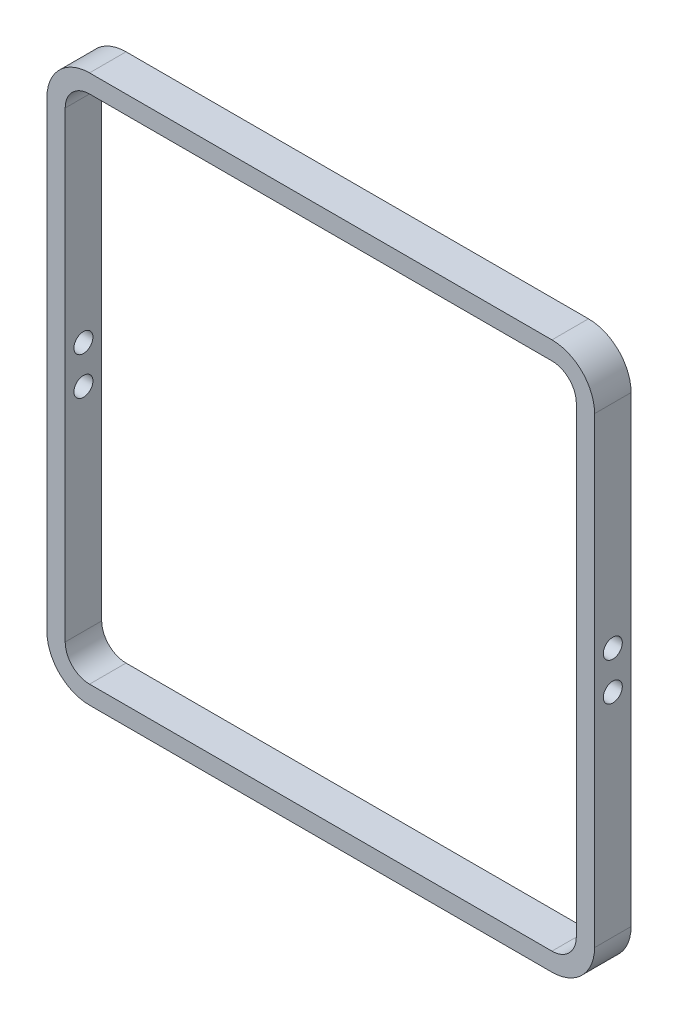
ISO-10303-21;
HEADER;
FILE_DESCRIPTION(('STEP AP214'),'2;1');
FILE_NAME('part.step','',(''),(''),'','','');
FILE_SCHEMA(('AUTOMOTIVE_DESIGN { 1 0 10303 214 1 1 1 1 }'));
ENDSEC;
DATA;
#1=APPLICATION_CONTEXT('core data for automotive mechanical design processes');
#2=APPLICATION_PROTOCOL_DEFINITION('international standard','automotive_design',2000,#1);
#3=PRODUCT_CONTEXT('',#1,'mechanical');
#4=PRODUCT('Part','Part','',(#3));
#5=PRODUCT_RELATED_PRODUCT_CATEGORY('part','',(#4));
#6=PRODUCT_DEFINITION_FORMATION('','',#4);
#7=PRODUCT_DEFINITION_CONTEXT('part definition',#1,'design');
#8=PRODUCT_DEFINITION('design','',#6,#7);
#9=PRODUCT_DEFINITION_SHAPE('','',#8);
#10=(LENGTH_UNIT() NAMED_UNIT(*) SI_UNIT(.MILLI.,.METRE.));
#11=(NAMED_UNIT(*) PLANE_ANGLE_UNIT() SI_UNIT($,.RADIAN.));
#12=(NAMED_UNIT(*) SI_UNIT($,.STERADIAN.) SOLID_ANGLE_UNIT());
#13=UNCERTAINTY_MEASURE_WITH_UNIT(LENGTH_MEASURE(1.E-05),#10,'distance_accuracy_value','');
#14=(GEOMETRIC_REPRESENTATION_CONTEXT(3) GLOBAL_UNCERTAINTY_ASSIGNED_CONTEXT((#13)) GLOBAL_UNIT_ASSIGNED_CONTEXT((#10,
#11,#12)) REPRESENTATION_CONTEXT('',''));
#15=CARTESIAN_POINT('',(0.,0.,0.));
#16=DIRECTION('',(0.,0.,1.));
#17=DIRECTION('',(1.,0.,0.));
#18=AXIS2_PLACEMENT_3D('',#15,#16,#17);
#19=CARTESIAN_POINT('',(0.,0.,15.));
#20=DIRECTION('',(0.,0.,-1.));
#21=DIRECTION('',(-1.,0.,0.));
#22=AXIS2_PLACEMENT_3D('',#19,#20,#21);
#23=PLANE('',#22);
#24=DIRECTION('',(0.,-1.,0.));
#25=VECTOR('',#24,1.);
#26=CARTESIAN_POINT('',(-112.5,-112.5,15.));
#27=LINE('',#26,#25);
#28=CARTESIAN_POINT('',(-112.5,95.,15.));
#29=VERTEX_POINT('',#28);
#30=CARTESIAN_POINT('',(-112.5,-95.,15.));
#31=VERTEX_POINT('',#30);
#32=EDGE_CURVE('E253',#29,#31,#27,.T.);
#33=ORIENTED_EDGE('',*,*,#32,.T.);
#34=CARTESIAN_POINT('',(-95.,-95.,15.));
#35=DIRECTION('',(0.,0.,-1.));
#36=DIRECTION('',(-1.,0.,0.));
#37=AXIS2_PLACEMENT_3D('',#34,#35,#36);
#38=CIRCLE('',#37,17.5);
#39=CARTESIAN_POINT('',(-95.,-112.5,15.));
#40=VERTEX_POINT('',#39);
#41=EDGE_CURVE('E232',#31,#40,#38,.F.);
#42=ORIENTED_EDGE('',*,*,#41,.T.);
#43=DIRECTION('',(1.,0.,0.));
#44=VECTOR('',#43,1.);
#45=CARTESIAN_POINT('',(112.5,-112.5,15.));
#46=LINE('',#45,#44);
#47=CARTESIAN_POINT('',(95.,-112.5,15.));
#48=VERTEX_POINT('',#47);
#49=EDGE_CURVE('E181',#40,#48,#46,.T.);
#50=ORIENTED_EDGE('',*,*,#49,.T.);
#51=CARTESIAN_POINT('',(95.,-95.,15.));
#52=DIRECTION('',(0.,0.,-1.));
#53=DIRECTION('',(-1.,0.,0.));
#54=AXIS2_PLACEMENT_3D('',#51,#52,#53);
#55=CIRCLE('',#54,17.5);
#56=CARTESIAN_POINT('',(112.5,-95.,15.));
#57=VERTEX_POINT('',#56);
#58=EDGE_CURVE('E56',#48,#57,#55,.F.);
#59=ORIENTED_EDGE('',*,*,#58,.T.);
#60=DIRECTION('',(0.,1.,0.));
#61=VECTOR('',#60,1.);
#62=CARTESIAN_POINT('',(112.5,-112.5,15.));
#63=LINE('',#62,#61);
#64=CARTESIAN_POINT('',(112.5,95.,15.));
#65=VERTEX_POINT('',#64);
#66=EDGE_CURVE('E180',#57,#65,#63,.T.);
#67=ORIENTED_EDGE('',*,*,#66,.T.);
#68=CARTESIAN_POINT('',(95.,95.,15.));
#69=DIRECTION('',(0.,0.,-1.));
#70=DIRECTION('',(-1.,0.,0.));
#71=AXIS2_PLACEMENT_3D('',#68,#69,#70);
#72=CIRCLE('',#71,17.5);
#73=CARTESIAN_POINT('',(95.,112.5,15.));
#74=VERTEX_POINT('',#73);
#75=EDGE_CURVE('E231',#65,#74,#72,.F.);
#76=ORIENTED_EDGE('',*,*,#75,.T.);
#77=DIRECTION('',(-1.,0.,0.));
#78=VECTOR('',#77,1.);
#79=CARTESIAN_POINT('',(112.5,112.5,15.));
#80=LINE('',#79,#78);
#81=CARTESIAN_POINT('',(-95.,112.5,15.));
#82=VERTEX_POINT('',#81);
#83=EDGE_CURVE('E252',#74,#82,#80,.T.);
#84=ORIENTED_EDGE('',*,*,#83,.T.);
#85=CARTESIAN_POINT('',(-95.,95.,15.));
#86=DIRECTION('',(0.,0.,-1.));
#87=DIRECTION('',(-1.,0.,0.));
#88=AXIS2_PLACEMENT_3D('',#85,#86,#87);
#89=CIRCLE('',#88,17.5);
#90=EDGE_CURVE('E233',#82,#29,#89,.F.);
#91=ORIENTED_EDGE('',*,*,#90,.T.);
#92=EDGE_LOOP('',(#33,#42,#50,#59,#67,#76,#84,#91));
#93=FACE_BOUND('',#92,.T.);
#94=DIRECTION('',(-1.,0.,0.));
#95=VECTOR('',#94,1.);
#96=CARTESIAN_POINT('',(105.,105.,15.));
#97=LINE('',#96,#95);
#98=CARTESIAN_POINT('',(95.,105.,15.));
#99=VERTEX_POINT('',#98);
#100=CARTESIAN_POINT('',(-95.,105.,15.));
#101=VERTEX_POINT('',#100);
#102=EDGE_CURVE('E173',#99,#101,#97,.T.);
#103=ORIENTED_EDGE('',*,*,#102,.F.);
#104=CARTESIAN_POINT('',(95.,95.,15.));
#105=DIRECTION('',(0.,0.,-1.));
#106=DIRECTION('',(-1.,0.,0.));
#107=AXIS2_PLACEMENT_3D('',#104,#105,#106);
#108=CIRCLE('',#107,10.);
#109=CARTESIAN_POINT('',(105.,95.,15.));
#110=VERTEX_POINT('',#109);
#111=EDGE_CURVE('E161',#99,#110,#108,.T.);
#112=ORIENTED_EDGE('',*,*,#111,.T.);
#113=DIRECTION('',(0.,1.,0.));
#114=VECTOR('',#113,1.);
#115=CARTESIAN_POINT('',(105.,-105.,15.));
#116=LINE('',#115,#114);
#117=CARTESIAN_POINT('',(105.,-95.,15.));
#118=VERTEX_POINT('',#117);
#119=EDGE_CURVE('E295',#118,#110,#116,.T.);
#120=ORIENTED_EDGE('',*,*,#119,.F.);
#121=CARTESIAN_POINT('',(95.,-95.,15.));
#122=DIRECTION('',(0.,0.,-1.));
#123=DIRECTION('',(-1.,0.,0.));
#124=AXIS2_PLACEMENT_3D('',#121,#122,#123);
#125=CIRCLE('',#124,10.);
#126=CARTESIAN_POINT('',(95.,-105.,15.));
#127=VERTEX_POINT('',#126);
#128=EDGE_CURVE('E162',#118,#127,#125,.T.);
#129=ORIENTED_EDGE('',*,*,#128,.T.);
#130=DIRECTION('',(1.,0.,0.));
#131=VECTOR('',#130,1.);
#132=CARTESIAN_POINT('',(105.,-105.,15.));
#133=LINE('',#132,#131);
#134=CARTESIAN_POINT('',(-95.0000000000001,-105.,15.));
#135=VERTEX_POINT('',#134);
#136=EDGE_CURVE('E293',#135,#127,#133,.T.);
#137=ORIENTED_EDGE('',*,*,#136,.F.);
#138=CARTESIAN_POINT('',(-95.,-95.,15.));
#139=DIRECTION('',(0.,0.,-1.));
#140=DIRECTION('',(-1.,0.,0.));
#141=AXIS2_PLACEMENT_3D('',#138,#139,#140);
#142=CIRCLE('',#141,10.);
#143=CARTESIAN_POINT('',(-105.,-95.,15.));
#144=VERTEX_POINT('',#143);
#145=EDGE_CURVE('E208',#135,#144,#142,.T.);
#146=ORIENTED_EDGE('',*,*,#145,.T.);
#147=DIRECTION('',(0.,-1.,0.));
#148=VECTOR('',#147,1.);
#149=CARTESIAN_POINT('',(-105.,-105.,15.));
#150=LINE('',#149,#148);
#151=CARTESIAN_POINT('',(-105.,95.,15.));
#152=VERTEX_POINT('',#151);
#153=EDGE_CURVE('E286',#152,#144,#150,.T.);
#154=ORIENTED_EDGE('',*,*,#153,.F.);
#155=CARTESIAN_POINT('',(-95.,95.,15.));
#156=DIRECTION('',(0.,0.,-1.));
#157=DIRECTION('',(-1.,0.,0.));
#158=AXIS2_PLACEMENT_3D('',#155,#156,#157);
#159=CIRCLE('',#158,10.);
#160=EDGE_CURVE('E207',#152,#101,#159,.T.);
#161=ORIENTED_EDGE('',*,*,#160,.T.);
#162=EDGE_LOOP('',(#103,#112,#120,#129,#137,#146,#154,#161));
#163=FACE_BOUND('',#162,.T.);
#164=ADVANCED_FACE('F39',(#93,#163),#23,.F.);
#165=CARTESIAN_POINT('',(0.,0.,0.));
#166=DIRECTION('',(0.,0.,-1.));
#167=DIRECTION('',(-1.,0.,0.));
#168=AXIS2_PLACEMENT_3D('',#165,#166,#167);
#169=PLANE('',#168);
#170=DIRECTION('',(1.,0.,0.));
#171=VECTOR('',#170,1.);
#172=CARTESIAN_POINT('',(112.5,-112.5,0.));
#173=LINE('',#172,#171);
#174=CARTESIAN_POINT('',(-95.,-112.5,0.));
#175=VERTEX_POINT('',#174);
#176=CARTESIAN_POINT('',(95.,-112.5,0.));
#177=VERTEX_POINT('',#176);
#178=EDGE_CURVE('E255',#175,#177,#173,.T.);
#179=ORIENTED_EDGE('',*,*,#178,.F.);
#180=CARTESIAN_POINT('',(-95.,-95.,0.));
#181=DIRECTION('',(0.,0.,-1.));
#182=DIRECTION('',(-1.,0.,0.));
#183=AXIS2_PLACEMENT_3D('',#180,#181,#182);
#184=CIRCLE('',#183,17.5);
#185=CARTESIAN_POINT('',(-112.5,-95.,0.));
#186=VERTEX_POINT('',#185);
#187=EDGE_CURVE('E221',#175,#186,#184,.T.);
#188=ORIENTED_EDGE('',*,*,#187,.T.);
#189=DIRECTION('',(0.,-1.,0.));
#190=VECTOR('',#189,1.);
#191=CARTESIAN_POINT('',(-112.5,-112.5,0.));
#192=LINE('',#191,#190);
#193=CARTESIAN_POINT('',(-112.5,95.,0.));
#194=VERTEX_POINT('',#193);
#195=EDGE_CURVE('E260',#194,#186,#192,.T.);
#196=ORIENTED_EDGE('',*,*,#195,.F.);
#197=CARTESIAN_POINT('',(-95.,95.,0.));
#198=DIRECTION('',(0.,0.,-1.));
#199=DIRECTION('',(-1.,0.,0.));
#200=AXIS2_PLACEMENT_3D('',#197,#198,#199);
#201=CIRCLE('',#200,17.5);
#202=CARTESIAN_POINT('',(-95.,112.5,0.));
#203=VERTEX_POINT('',#202);
#204=EDGE_CURVE('E218',#194,#203,#201,.T.);
#205=ORIENTED_EDGE('',*,*,#204,.T.);
#206=DIRECTION('',(-1.,0.,0.));
#207=VECTOR('',#206,1.);
#208=CARTESIAN_POINT('',(112.5,112.5,0.));
#209=LINE('',#208,#207);
#210=CARTESIAN_POINT('',(95.,112.5,0.));
#211=VERTEX_POINT('',#210);
#212=EDGE_CURVE('E298',#211,#203,#209,.T.);
#213=ORIENTED_EDGE('',*,*,#212,.F.);
#214=CARTESIAN_POINT('',(95.,95.,0.));
#215=DIRECTION('',(0.,0.,-1.));
#216=DIRECTION('',(-1.,0.,0.));
#217=AXIS2_PLACEMENT_3D('',#214,#215,#216);
#218=CIRCLE('',#217,17.5);
#219=CARTESIAN_POINT('',(112.5,95.,0.));
#220=VERTEX_POINT('',#219);
#221=EDGE_CURVE('E223',#211,#220,#218,.T.);
#222=ORIENTED_EDGE('',*,*,#221,.T.);
#223=DIRECTION('',(0.,1.,0.));
#224=VECTOR('',#223,1.);
#225=CARTESIAN_POINT('',(112.5,-112.5,0.));
#226=LINE('',#225,#224);
#227=CARTESIAN_POINT('',(112.5,-95.,0.));
#228=VERTEX_POINT('',#227);
#229=EDGE_CURVE('E244',#228,#220,#226,.T.);
#230=ORIENTED_EDGE('',*,*,#229,.F.);
#231=CARTESIAN_POINT('',(95.,-95.,0.));
#232=DIRECTION('',(0.,0.,-1.));
#233=DIRECTION('',(-1.,0.,0.));
#234=AXIS2_PLACEMENT_3D('',#231,#232,#233);
#235=CIRCLE('',#234,17.5);
#236=EDGE_CURVE('E220',#228,#177,#235,.T.);
#237=ORIENTED_EDGE('',*,*,#236,.T.);
#238=EDGE_LOOP('',(#179,#188,#196,#205,#213,#222,#230,#237));
#239=FACE_BOUND('',#238,.T.);
#240=DIRECTION('',(1.,0.,0.));
#241=VECTOR('',#240,1.);
#242=CARTESIAN_POINT('',(105.,-105.,0.));
#243=LINE('',#242,#241);
#244=CARTESIAN_POINT('',(-95.0000000000001,-105.,0.));
#245=VERTEX_POINT('',#244);
#246=CARTESIAN_POINT('',(95.,-105.,0.));
#247=VERTEX_POINT('',#246);
#248=EDGE_CURVE('E160',#245,#247,#243,.T.);
#249=ORIENTED_EDGE('',*,*,#248,.T.);
#250=CARTESIAN_POINT('',(95.,-95.,0.));
#251=DIRECTION('',(0.,0.,-1.));
#252=DIRECTION('',(-1.,0.,0.));
#253=AXIS2_PLACEMENT_3D('',#250,#251,#252);
#254=CIRCLE('',#253,10.);
#255=CARTESIAN_POINT('',(105.,-95.,0.));
#256=VERTEX_POINT('',#255);
#257=EDGE_CURVE('E155',#247,#256,#254,.F.);
#258=ORIENTED_EDGE('',*,*,#257,.T.);
#259=DIRECTION('',(0.,1.,0.));
#260=VECTOR('',#259,1.);
#261=CARTESIAN_POINT('',(105.,-105.,0.));
#262=LINE('',#261,#260);
#263=CARTESIAN_POINT('',(105.,95.,0.));
#264=VERTEX_POINT('',#263);
#265=EDGE_CURVE('E154',#256,#264,#262,.T.);
#266=ORIENTED_EDGE('',*,*,#265,.T.);
#267=CARTESIAN_POINT('',(95.,95.,0.));
#268=DIRECTION('',(0.,0.,-1.));
#269=DIRECTION('',(-1.,0.,0.));
#270=AXIS2_PLACEMENT_3D('',#267,#268,#269);
#271=CIRCLE('',#270,10.);
#272=CARTESIAN_POINT('',(95.,105.,0.));
#273=VERTEX_POINT('',#272);
#274=EDGE_CURVE('E199',#264,#273,#271,.F.);
#275=ORIENTED_EDGE('',*,*,#274,.T.);
#276=DIRECTION('',(-1.,0.,0.));
#277=VECTOR('',#276,1.);
#278=CARTESIAN_POINT('',(105.,105.,0.));
#279=LINE('',#278,#277);
#280=CARTESIAN_POINT('',(-95.,105.,0.));
#281=VERTEX_POINT('',#280);
#282=EDGE_CURVE('E284',#273,#281,#279,.T.);
#283=ORIENTED_EDGE('',*,*,#282,.T.);
#284=CARTESIAN_POINT('',(-95.,95.,0.));
#285=DIRECTION('',(0.,0.,-1.));
#286=DIRECTION('',(-1.,0.,0.));
#287=AXIS2_PLACEMENT_3D('',#284,#285,#286);
#288=CIRCLE('',#287,10.);
#289=CARTESIAN_POINT('',(-105.,95.,0.));
#290=VERTEX_POINT('',#289);
#291=EDGE_CURVE('E202',#281,#290,#288,.F.);
#292=ORIENTED_EDGE('',*,*,#291,.T.);
#293=DIRECTION('',(0.,-1.,0.));
#294=VECTOR('',#293,1.);
#295=CARTESIAN_POINT('',(-105.,-105.,0.));
#296=LINE('',#295,#294);
#297=CARTESIAN_POINT('',(-105.,-95.,0.));
#298=VERTEX_POINT('',#297);
#299=EDGE_CURVE('E299',#290,#298,#296,.T.);
#300=ORIENTED_EDGE('',*,*,#299,.T.);
#301=CARTESIAN_POINT('',(-95.,-95.,0.));
#302=DIRECTION('',(0.,0.,-1.));
#303=DIRECTION('',(-1.,0.,0.));
#304=AXIS2_PLACEMENT_3D('',#301,#302,#303);
#305=CIRCLE('',#304,10.);
#306=EDGE_CURVE('E206',#298,#245,#305,.F.);
#307=ORIENTED_EDGE('',*,*,#306,.T.);
#308=EDGE_LOOP('',(#249,#258,#266,#275,#283,#292,#300,#307));
#309=FACE_BOUND('',#308,.T.);
#310=ADVANCED_FACE('F153',(#239,#309),#169,.T.);
#311=CARTESIAN_POINT('',(112.5,112.5,15.));
#312=DIRECTION('',(0.,-1.,0.));
#313=DIRECTION('',(1.,0.,0.));
#314=AXIS2_PLACEMENT_3D('',#311,#312,#313);
#315=PLANE('',#314);
#316=ORIENTED_EDGE('',*,*,#83,.F.);
#317=DIRECTION('',(0.,0.,-1.));
#318=VECTOR('',#317,1.);
#319=CARTESIAN_POINT('',(95.,112.5,15.));
#320=LINE('',#319,#318);
#321=EDGE_CURVE('E237',#74,#211,#320,.T.);
#322=ORIENTED_EDGE('',*,*,#321,.T.);
#323=ORIENTED_EDGE('',*,*,#212,.T.);
#324=DIRECTION('',(0.,0.,-1.));
#325=VECTOR('',#324,1.);
#326=CARTESIAN_POINT('',(-95.,112.5,15.));
#327=LINE('',#326,#325);
#328=EDGE_CURVE('E240',#203,#82,#327,.F.);
#329=ORIENTED_EDGE('',*,*,#328,.T.);
#330=EDGE_LOOP('',(#316,#322,#323,#329));
#331=FACE_BOUND('',#330,.T.);
#332=ADVANCED_FACE('F337',(#331),#315,.F.);
#333=CARTESIAN_POINT('',(-112.5,-112.5,15.));
#334=DIRECTION('',(1.,0.,0.));
#335=DIRECTION('',(0.,1.,0.));
#336=AXIS2_PLACEMENT_3D('',#333,#334,#335);
#337=PLANE('',#336);
#338=CARTESIAN_POINT('',(-112.5,-7.8,7.5));
#339=DIRECTION('',(1.,0.,0.));
#340=DIRECTION('',(0.,0.,-1.));
#341=AXIS2_PLACEMENT_3D('',#338,#339,#340);
#342=CIRCLE('',#341,3.9);
#343=CARTESIAN_POINT('',(-112.5,-7.8,3.6));
#344=VERTEX_POINT('',#343);
#345=EDGE_CURVE('E262',#344,#344,#342,.T.);
#346=ORIENTED_EDGE('',*,*,#345,.T.);
#347=EDGE_LOOP('',(#346));
#348=FACE_BOUND('',#347,.T.);
#349=CARTESIAN_POINT('',(-112.5,7.8,7.5));
#350=DIRECTION('',(1.,0.,0.));
#351=DIRECTION('',(0.,0.,1.));
#352=AXIS2_PLACEMENT_3D('',#349,#350,#351);
#353=CIRCLE('',#352,3.9);
#354=CARTESIAN_POINT('',(-112.5,7.8,11.4));
#355=VERTEX_POINT('',#354);
#356=EDGE_CURVE('E276',#355,#355,#353,.T.);
#357=ORIENTED_EDGE('',*,*,#356,.T.);
#358=EDGE_LOOP('',(#357));
#359=FACE_BOUND('',#358,.T.);
#360=ORIENTED_EDGE('',*,*,#195,.T.);
#361=DIRECTION('',(0.,0.,-1.));
#362=VECTOR('',#361,1.);
#363=CARTESIAN_POINT('',(-112.5,-95.,15.));
#364=LINE('',#363,#362);
#365=EDGE_CURVE('E226',#186,#31,#364,.F.);
#366=ORIENTED_EDGE('',*,*,#365,.T.);
#367=ORIENTED_EDGE('',*,*,#32,.F.);
#368=DIRECTION('',(0.,0.,-1.));
#369=VECTOR('',#368,1.);
#370=CARTESIAN_POINT('',(-112.5,95.,15.));
#371=LINE('',#370,#369);
#372=EDGE_CURVE('E224',#29,#194,#371,.T.);
#373=ORIENTED_EDGE('',*,*,#372,.T.);
#374=EDGE_LOOP('',(#360,#366,#367,#373));
#375=FACE_BOUND('',#374,.T.);
#376=ADVANCED_FACE('F311',(#348,#359,#375),#337,.F.);
#377=CARTESIAN_POINT('',(112.5,-112.5,15.));
#378=DIRECTION('',(0.,1.,0.));
#379=DIRECTION('',(0.,0.,1.));
#380=AXIS2_PLACEMENT_3D('',#377,#378,#379);
#381=PLANE('',#380);
#382=ORIENTED_EDGE('',*,*,#49,.F.);
#383=DIRECTION('',(0.,0.,-1.));
#384=VECTOR('',#383,1.);
#385=CARTESIAN_POINT('',(-95.,-112.5,15.));
#386=LINE('',#385,#384);
#387=EDGE_CURVE('E211',#40,#175,#386,.T.);
#388=ORIENTED_EDGE('',*,*,#387,.T.);
#389=ORIENTED_EDGE('',*,*,#178,.T.);
#390=DIRECTION('',(0.,0.,-1.));
#391=VECTOR('',#390,1.);
#392=CARTESIAN_POINT('',(95.,-112.5,15.));
#393=LINE('',#392,#391);
#394=EDGE_CURVE('E215',#177,#48,#393,.F.);
#395=ORIENTED_EDGE('',*,*,#394,.T.);
#396=EDGE_LOOP('',(#382,#388,#389,#395));
#397=FACE_BOUND('',#396,.T.);
#398=ADVANCED_FACE('F322',(#397),#381,.F.);
#399=CARTESIAN_POINT('',(112.5,-112.5,15.));
#400=DIRECTION('',(-1.,0.,0.));
#401=DIRECTION('',(0.,0.,1.));
#402=AXIS2_PLACEMENT_3D('',#399,#400,#401);
#403=PLANE('',#402);
#404=CARTESIAN_POINT('',(112.5,-7.8,7.5));
#405=DIRECTION('',(1.,0.,0.));
#406=DIRECTION('',(0.,0.,-1.));
#407=AXIS2_PLACEMENT_3D('',#404,#405,#406);
#408=CIRCLE('',#407,3.9);
#409=CARTESIAN_POINT('',(112.5,-7.8,3.6));
#410=VERTEX_POINT('',#409);
#411=EDGE_CURVE('E267',#410,#410,#408,.T.);
#412=ORIENTED_EDGE('',*,*,#411,.F.);
#413=EDGE_LOOP('',(#412));
#414=FACE_BOUND('',#413,.T.);
#415=CARTESIAN_POINT('',(112.5,7.8,7.5));
#416=DIRECTION('',(1.,0.,0.));
#417=DIRECTION('',(0.,0.,1.));
#418=AXIS2_PLACEMENT_3D('',#415,#416,#417);
#419=CIRCLE('',#418,3.9);
#420=CARTESIAN_POINT('',(112.5,7.8,11.4));
#421=VERTEX_POINT('',#420);
#422=EDGE_CURVE('E274',#421,#421,#419,.T.);
#423=ORIENTED_EDGE('',*,*,#422,.F.);
#424=EDGE_LOOP('',(#423));
#425=FACE_BOUND('',#424,.T.);
#426=ORIENTED_EDGE('',*,*,#229,.T.);
#427=DIRECTION('',(0.,0.,-1.));
#428=VECTOR('',#427,1.);
#429=CARTESIAN_POINT('',(112.5,95.,15.));
#430=LINE('',#429,#428);
#431=EDGE_CURVE('E11',#220,#65,#430,.F.);
#432=ORIENTED_EDGE('',*,*,#431,.T.);
#433=ORIENTED_EDGE('',*,*,#66,.F.);
#434=DIRECTION('',(0.,0.,-1.));
#435=VECTOR('',#434,1.);
#436=CARTESIAN_POINT('',(112.5,-95.,15.));
#437=LINE('',#436,#435);
#438=EDGE_CURVE('E50',#57,#228,#437,.T.);
#439=ORIENTED_EDGE('',*,*,#438,.T.);
#440=EDGE_LOOP('',(#426,#432,#433,#439));
#441=FACE_BOUND('',#440,.T.);
#442=ADVANCED_FACE('F242',(#414,#425,#441),#403,.F.);
#443=CARTESIAN_POINT('',(105.,105.,15.));
#444=DIRECTION('',(0.,-1.,0.));
#445=DIRECTION('',(0.,0.,-1.));
#446=AXIS2_PLACEMENT_3D('',#443,#444,#445);
#447=PLANE('',#446);
#448=ORIENTED_EDGE('',*,*,#282,.F.);
#449=DIRECTION('',(0.,0.,-1.));
#450=VECTOR('',#449,1.);
#451=CARTESIAN_POINT('',(95.,105.,15.));
#452=LINE('',#451,#450);
#453=EDGE_CURVE('E186',#273,#99,#452,.F.);
#454=ORIENTED_EDGE('',*,*,#453,.T.);
#455=ORIENTED_EDGE('',*,*,#102,.T.);
#456=DIRECTION('',(0.,0.,-1.));
#457=VECTOR('',#456,1.);
#458=CARTESIAN_POINT('',(-95.,105.,0.));
#459=LINE('',#458,#457);
#460=EDGE_CURVE('E177',#101,#281,#459,.T.);
#461=ORIENTED_EDGE('',*,*,#460,.T.);
#462=EDGE_LOOP('',(#448,#454,#455,#461));
#463=FACE_BOUND('',#462,.T.);
#464=ADVANCED_FACE('F339',(#463),#447,.T.);
#465=CARTESIAN_POINT('',(-105.,-105.,15.));
#466=DIRECTION('',(1.,0.,0.));
#467=DIRECTION('',(0.,1.,0.));
#468=AXIS2_PLACEMENT_3D('',#465,#466,#467);
#469=PLANE('',#468);
#470=CARTESIAN_POINT('',(-105.,-7.8,7.5));
#471=DIRECTION('',(1.,0.,0.));
#472=DIRECTION('',(0.,1.,0.));
#473=AXIS2_PLACEMENT_3D('',#470,#471,#472);
#474=CIRCLE('',#473,3.9);
#475=CARTESIAN_POINT('',(-105.,-3.9,7.5));
#476=VERTEX_POINT('',#475);
#477=EDGE_CURVE('E285',#476,#476,#474,.T.);
#478=ORIENTED_EDGE('',*,*,#477,.F.);
#479=EDGE_LOOP('',(#478));
#480=FACE_BOUND('',#479,.T.);
#481=CARTESIAN_POINT('',(-105.,7.8,7.5));
#482=DIRECTION('',(1.,0.,0.));
#483=DIRECTION('',(0.,1.,0.));
#484=AXIS2_PLACEMENT_3D('',#481,#482,#483);
#485=CIRCLE('',#484,3.9);
#486=CARTESIAN_POINT('',(-105.,11.7,7.5));
#487=VERTEX_POINT('',#486);
#488=EDGE_CURVE('E265',#487,#487,#485,.T.);
#489=ORIENTED_EDGE('',*,*,#488,.F.);
#490=EDGE_LOOP('',(#489));
#491=FACE_BOUND('',#490,.T.);
#492=ORIENTED_EDGE('',*,*,#299,.F.);
#493=DIRECTION('',(0.,0.,-1.));
#494=VECTOR('',#493,1.);
#495=CARTESIAN_POINT('',(-105.,95.,15.));
#496=LINE('',#495,#494);
#497=EDGE_CURVE('E197',#290,#152,#496,.F.);
#498=ORIENTED_EDGE('',*,*,#497,.T.);
#499=ORIENTED_EDGE('',*,*,#153,.T.);
#500=DIRECTION('',(0.,0.,-1.));
#501=VECTOR('',#500,1.);
#502=CARTESIAN_POINT('',(-105.,-95.,0.));
#503=LINE('',#502,#501);
#504=EDGE_CURVE('E193',#144,#298,#503,.T.);
#505=ORIENTED_EDGE('',*,*,#504,.T.);
#506=EDGE_LOOP('',(#492,#498,#499,#505));
#507=FACE_BOUND('',#506,.T.);
#508=ADVANCED_FACE('F461',(#480,#491,#507),#469,.T.);
#509=CARTESIAN_POINT('',(105.,-105.,15.));
#510=DIRECTION('',(0.,1.,0.));
#511=DIRECTION('',(-1.,0.,0.));
#512=AXIS2_PLACEMENT_3D('',#509,#510,#511);
#513=PLANE('',#512);
#514=ORIENTED_EDGE('',*,*,#136,.T.);
#515=DIRECTION('',(0.,0.,-1.));
#516=VECTOR('',#515,1.);
#517=CARTESIAN_POINT('',(95.,-105.,0.));
#518=LINE('',#517,#516);
#519=EDGE_CURVE('E194',#127,#247,#518,.T.);
#520=ORIENTED_EDGE('',*,*,#519,.T.);
#521=ORIENTED_EDGE('',*,*,#248,.F.);
#522=DIRECTION('',(0.,0.,-1.));
#523=VECTOR('',#522,1.);
#524=CARTESIAN_POINT('',(-95.,-105.,15.));
#525=LINE('',#524,#523);
#526=EDGE_CURVE('E192',#245,#135,#525,.F.);
#527=ORIENTED_EDGE('',*,*,#526,.T.);
#528=EDGE_LOOP('',(#514,#520,#521,#527));
#529=FACE_BOUND('',#528,.T.);
#530=ADVANCED_FACE('F451',(#529),#513,.T.);
#531=CARTESIAN_POINT('',(105.,-105.,15.));
#532=DIRECTION('',(-1.,0.,0.));
#533=DIRECTION('',(0.,0.,1.));
#534=AXIS2_PLACEMENT_3D('',#531,#532,#533);
#535=PLANE('',#534);
#536=CARTESIAN_POINT('',(105.,-7.8,7.5));
#537=DIRECTION('',(-1.,0.,0.));
#538=DIRECTION('',(0.,0.,1.));
#539=AXIS2_PLACEMENT_3D('',#536,#537,#538);
#540=CIRCLE('',#539,3.9);
#541=CARTESIAN_POINT('',(105.,-7.8,11.4));
#542=VERTEX_POINT('',#541);
#543=EDGE_CURVE('E183',#542,#542,#540,.T.);
#544=ORIENTED_EDGE('',*,*,#543,.F.);
#545=EDGE_LOOP('',(#544));
#546=FACE_BOUND('',#545,.T.);
#547=CARTESIAN_POINT('',(105.,7.8,7.5));
#548=DIRECTION('',(-1.,0.,0.));
#549=DIRECTION('',(0.,0.,1.));
#550=AXIS2_PLACEMENT_3D('',#547,#548,#549);
#551=CIRCLE('',#550,3.9);
#552=CARTESIAN_POINT('',(105.,7.8,11.4));
#553=VERTEX_POINT('',#552);
#554=EDGE_CURVE('E258',#553,#553,#551,.T.);
#555=ORIENTED_EDGE('',*,*,#554,.F.);
#556=EDGE_LOOP('',(#555));
#557=FACE_BOUND('',#556,.T.);
#558=ORIENTED_EDGE('',*,*,#119,.T.);
#559=DIRECTION('',(0.,0.,-1.));
#560=VECTOR('',#559,1.);
#561=CARTESIAN_POINT('',(105.,95.,0.));
#562=LINE('',#561,#560);
#563=EDGE_CURVE('E175',#110,#264,#562,.T.);
#564=ORIENTED_EDGE('',*,*,#563,.T.);
#565=ORIENTED_EDGE('',*,*,#265,.F.);
#566=DIRECTION('',(0.,0.,-1.));
#567=VECTOR('',#566,1.);
#568=CARTESIAN_POINT('',(105.,-95.,15.));
#569=LINE('',#568,#567);
#570=EDGE_CURVE('E169',#256,#118,#569,.F.);
#571=ORIENTED_EDGE('',*,*,#570,.T.);
#572=EDGE_LOOP('',(#558,#564,#565,#571));
#573=FACE_BOUND('',#572,.T.);
#574=ADVANCED_FACE('F166',(#546,#557,#573),#535,.T.);
#575=CARTESIAN_POINT('',(-112.5,7.8,7.5));
#576=DIRECTION('',(1.,0.,0.));
#577=DIRECTION('',(0.,0.,-1.));
#578=AXIS2_PLACEMENT_3D('',#575,#576,#577);
#579=CYLINDRICAL_SURFACE('',#578,3.9);
#580=ORIENTED_EDGE('',*,*,#554,.T.);
#581=EDGE_LOOP('',(#580));
#582=FACE_BOUND('',#581,.T.);
#583=ORIENTED_EDGE('',*,*,#422,.T.);
#584=EDGE_LOOP('',(#583));
#585=FACE_BOUND('',#584,.T.);
#586=ADVANCED_FACE('F432',(#582,#585),#579,.F.);
#587=CARTESIAN_POINT('',(-112.5,-7.8,7.5));
#588=DIRECTION('',(1.,0.,0.));
#589=DIRECTION('',(0.,0.,-1.));
#590=AXIS2_PLACEMENT_3D('',#587,#588,#589);
#591=CYLINDRICAL_SURFACE('',#590,3.9);
#592=ORIENTED_EDGE('',*,*,#543,.T.);
#593=EDGE_LOOP('',(#592));
#594=FACE_BOUND('',#593,.T.);
#595=ORIENTED_EDGE('',*,*,#411,.T.);
#596=EDGE_LOOP('',(#595));
#597=FACE_BOUND('',#596,.T.);
#598=ADVANCED_FACE('F424',(#594,#597),#591,.F.);
#599=ORIENTED_EDGE('',*,*,#488,.T.);
#600=EDGE_LOOP('',(#599));
#601=FACE_BOUND('',#600,.T.);
#602=ORIENTED_EDGE('',*,*,#356,.F.);
#603=EDGE_LOOP('',(#602));
#604=FACE_BOUND('',#603,.T.);
#605=ADVANCED_FACE('F422',(#601,#604),#579,.F.);
#606=ORIENTED_EDGE('',*,*,#477,.T.);
#607=EDGE_LOOP('',(#606));
#608=FACE_BOUND('',#607,.T.);
#609=ORIENTED_EDGE('',*,*,#345,.F.);
#610=EDGE_LOOP('',(#609));
#611=FACE_BOUND('',#610,.T.);
#612=ADVANCED_FACE('F354',(#608,#611),#591,.F.);
#613=CARTESIAN_POINT('',(95.,95.,15.));
#614=DIRECTION('',(0.,0.,1.));
#615=DIRECTION('',(1.,0.,0.));
#616=AXIS2_PLACEMENT_3D('',#613,#614,#615);
#617=CYLINDRICAL_SURFACE('',#616,10.);
#618=ORIENTED_EDGE('',*,*,#111,.F.);
#619=ORIENTED_EDGE('',*,*,#453,.F.);
#620=ORIENTED_EDGE('',*,*,#274,.F.);
#621=ORIENTED_EDGE('',*,*,#563,.F.);
#622=EDGE_LOOP('',(#618,#619,#620,#621));
#623=FACE_BOUND('',#622,.T.);
#624=ADVANCED_FACE('F355',(#623),#617,.F.);
#625=CARTESIAN_POINT('',(95.,-95.,15.));
#626=DIRECTION('',(0.,0.,1.));
#627=DIRECTION('',(1.,0.,0.));
#628=AXIS2_PLACEMENT_3D('',#625,#626,#627);
#629=CYLINDRICAL_SURFACE('',#628,10.);
#630=ORIENTED_EDGE('',*,*,#128,.F.);
#631=ORIENTED_EDGE('',*,*,#570,.F.);
#632=ORIENTED_EDGE('',*,*,#257,.F.);
#633=ORIENTED_EDGE('',*,*,#519,.F.);
#634=EDGE_LOOP('',(#630,#631,#632,#633));
#635=FACE_BOUND('',#634,.T.);
#636=ADVANCED_FACE('F176',(#635),#629,.F.);
#637=CARTESIAN_POINT('',(-95.,95.,15.));
#638=DIRECTION('',(0.,0.,1.));
#639=DIRECTION('',(1.,0.,0.));
#640=AXIS2_PLACEMENT_3D('',#637,#638,#639);
#641=CYLINDRICAL_SURFACE('',#640,10.);
#642=ORIENTED_EDGE('',*,*,#160,.F.);
#643=ORIENTED_EDGE('',*,*,#497,.F.);
#644=ORIENTED_EDGE('',*,*,#291,.F.);
#645=ORIENTED_EDGE('',*,*,#460,.F.);
#646=EDGE_LOOP('',(#642,#643,#644,#645));
#647=FACE_BOUND('',#646,.T.);
#648=ADVANCED_FACE('F360',(#647),#641,.F.);
#649=CARTESIAN_POINT('',(-95.,-95.,15.));
#650=DIRECTION('',(0.,0.,1.));
#651=DIRECTION('',(1.,0.,0.));
#652=AXIS2_PLACEMENT_3D('',#649,#650,#651);
#653=CYLINDRICAL_SURFACE('',#652,10.);
#654=ORIENTED_EDGE('',*,*,#145,.F.);
#655=ORIENTED_EDGE('',*,*,#526,.F.);
#656=ORIENTED_EDGE('',*,*,#306,.F.);
#657=ORIENTED_EDGE('',*,*,#504,.F.);
#658=EDGE_LOOP('',(#654,#655,#656,#657));
#659=FACE_BOUND('',#658,.T.);
#660=ADVANCED_FACE('F365',(#659),#653,.F.);
#661=CARTESIAN_POINT('',(-95.,-95.,15.));
#662=DIRECTION('',(0.,0.,-1.));
#663=DIRECTION('',(-1.,0.,0.));
#664=AXIS2_PLACEMENT_3D('',#661,#662,#663);
#665=CYLINDRICAL_SURFACE('',#664,17.5);
#666=ORIENTED_EDGE('',*,*,#41,.F.);
#667=ORIENTED_EDGE('',*,*,#365,.F.);
#668=ORIENTED_EDGE('',*,*,#187,.F.);
#669=ORIENTED_EDGE('',*,*,#387,.F.);
#670=EDGE_LOOP('',(#666,#667,#668,#669));
#671=FACE_BOUND('',#670,.T.);
#672=ADVANCED_FACE('F317',(#671),#665,.T.);
#673=CARTESIAN_POINT('',(95.,95.,15.));
#674=DIRECTION('',(0.,0.,-1.));
#675=DIRECTION('',(-1.,0.,0.));
#676=AXIS2_PLACEMENT_3D('',#673,#674,#675);
#677=CYLINDRICAL_SURFACE('',#676,17.5);
#678=ORIENTED_EDGE('',*,*,#75,.F.);
#679=ORIENTED_EDGE('',*,*,#431,.F.);
#680=ORIENTED_EDGE('',*,*,#221,.F.);
#681=ORIENTED_EDGE('',*,*,#321,.F.);
#682=EDGE_LOOP('',(#678,#679,#680,#681));
#683=FACE_BOUND('',#682,.T.);
#684=ADVANCED_FACE('F327',(#683),#677,.T.);
#685=CARTESIAN_POINT('',(-95.,95.,15.));
#686=DIRECTION('',(0.,0.,-1.));
#687=DIRECTION('',(-1.,0.,0.));
#688=AXIS2_PLACEMENT_3D('',#685,#686,#687);
#689=CYLINDRICAL_SURFACE('',#688,17.5);
#690=ORIENTED_EDGE('',*,*,#90,.F.);
#691=ORIENTED_EDGE('',*,*,#328,.F.);
#692=ORIENTED_EDGE('',*,*,#204,.F.);
#693=ORIENTED_EDGE('',*,*,#372,.F.);
#694=EDGE_LOOP('',(#690,#691,#692,#693));
#695=FACE_BOUND('',#694,.T.);
#696=ADVANCED_FACE('F321',(#695),#689,.T.);
#697=CARTESIAN_POINT('',(95.,-95.,15.));
#698=DIRECTION('',(0.,0.,-1.));
#699=DIRECTION('',(-1.,0.,0.));
#700=AXIS2_PLACEMENT_3D('',#697,#698,#699);
#701=CYLINDRICAL_SURFACE('',#700,17.5);
#702=ORIENTED_EDGE('',*,*,#58,.F.);
#703=ORIENTED_EDGE('',*,*,#394,.F.);
#704=ORIENTED_EDGE('',*,*,#236,.F.);
#705=ORIENTED_EDGE('',*,*,#438,.F.);
#706=EDGE_LOOP('',(#702,#703,#704,#705));
#707=FACE_BOUND('',#706,.T.);
#708=ADVANCED_FACE('F41',(#707),#701,.T.);
#709=CLOSED_SHELL('',(#164,#310,#332,#376,#398,#442,#464,#508,#530,#574,#586,#598,#605,#612,
#624,#636,#648,#660,#672,#684,#696,#708));
#710=MANIFOLD_SOLID_BREP('B2',#709);
#711=ADVANCED_BREP_SHAPE_REPRESENTATION('',(#18,#710),#14);
#712=SHAPE_DEFINITION_REPRESENTATION(#9,#711);
ENDSEC;
END-ISO-10303-21;
